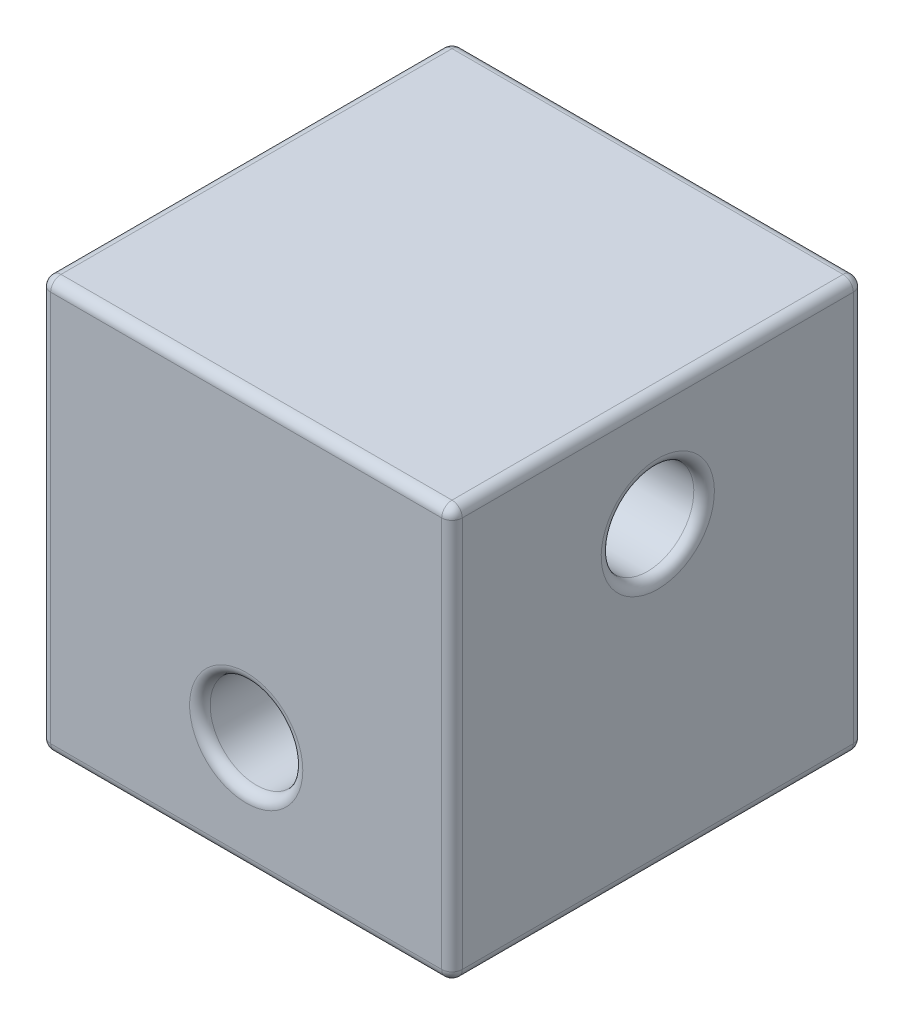
ISO-10303-21;
HEADER;
FILE_DESCRIPTION(('STEP AP214'),'2;1');
FILE_NAME('part.step','',(''),(''),'','','');
FILE_SCHEMA(('AUTOMOTIVE_DESIGN { 1 0 10303 214 1 1 1 1 }'));
ENDSEC;
DATA;
#1=APPLICATION_CONTEXT('core data for automotive mechanical design processes');
#2=APPLICATION_PROTOCOL_DEFINITION('international standard','automotive_design',2000,#1);
#3=PRODUCT_CONTEXT('',#1,'mechanical');
#4=PRODUCT('Part','Part','',(#3));
#5=PRODUCT_RELATED_PRODUCT_CATEGORY('part','',(#4));
#6=PRODUCT_DEFINITION_FORMATION('','',#4);
#7=PRODUCT_DEFINITION_CONTEXT('part definition',#1,'design');
#8=PRODUCT_DEFINITION('design','',#6,#7);
#9=PRODUCT_DEFINITION_SHAPE('','',#8);
#10=(LENGTH_UNIT() NAMED_UNIT(*) SI_UNIT(.MILLI.,.METRE.));
#11=(NAMED_UNIT(*) PLANE_ANGLE_UNIT() SI_UNIT($,.RADIAN.));
#12=(NAMED_UNIT(*) SI_UNIT($,.STERADIAN.) SOLID_ANGLE_UNIT());
#13=UNCERTAINTY_MEASURE_WITH_UNIT(LENGTH_MEASURE(1.E-05),#10,'distance_accuracy_value','');
#14=(GEOMETRIC_REPRESENTATION_CONTEXT(3) GLOBAL_UNCERTAINTY_ASSIGNED_CONTEXT((#13)) GLOBAL_UNIT_ASSIGNED_CONTEXT((#10,
#11,#12)) REPRESENTATION_CONTEXT('',''));
#15=CARTESIAN_POINT('',(0.,0.,0.));
#16=DIRECTION('',(0.,0.,1.));
#17=DIRECTION('',(1.,0.,0.));
#18=AXIS2_PLACEMENT_3D('',#15,#16,#17);
#19=CARTESIAN_POINT('',(20.,20.,20.));
#20=DIRECTION('',(-1.,0.,0.));
#21=DIRECTION('',(0.,-1.,0.));
#22=AXIS2_PLACEMENT_3D('',#19,#20,#21);
#23=PLANE('',#22);
#24=CARTESIAN_POINT('',(20.,9.,0.));
#25=DIRECTION('',(-1.,0.,0.));
#26=DIRECTION('',(0.,-1.,0.));
#27=AXIS2_PLACEMENT_3D('',#24,#25,#26);
#28=CIRCLE('',#27,5.5);
#29=CARTESIAN_POINT('',(20.,3.5,0.));
#30=VERTEX_POINT('',#29);
#31=EDGE_CURVE('E216',#30,#30,#28,.T.);
#32=ORIENTED_EDGE('',*,*,#31,.T.);
#33=EDGE_LOOP('',(#32));
#34=FACE_BOUND('',#33,.T.);
#35=DIRECTION('',(0.,1.,0.));
#36=VECTOR('',#35,1.);
#37=CARTESIAN_POINT('',(20.,-20.,19.));
#38=LINE('',#37,#36);
#39=CARTESIAN_POINT('',(20.,19.,19.));
#40=VERTEX_POINT('',#39);
#41=CARTESIAN_POINT('',(20.,-19.,19.));
#42=VERTEX_POINT('',#41);
#43=EDGE_CURVE('E203',#40,#42,#38,.F.);
#44=ORIENTED_EDGE('',*,*,#43,.T.);
#45=DIRECTION('',(0.,0.,-1.));
#46=VECTOR('',#45,1.);
#47=CARTESIAN_POINT('',(20.,-19.,20.));
#48=LINE('',#47,#46);
#49=CARTESIAN_POINT('',(20.,-19.,-19.));
#50=VERTEX_POINT('',#49);
#51=EDGE_CURVE('E212',#42,#50,#48,.T.);
#52=ORIENTED_EDGE('',*,*,#51,.T.);
#53=DIRECTION('',(0.,1.,0.));
#54=VECTOR('',#53,1.);
#55=CARTESIAN_POINT('',(20.,20.,-19.));
#56=LINE('',#55,#54);
#57=CARTESIAN_POINT('',(20.,19.,-19.));
#58=VERTEX_POINT('',#57);
#59=EDGE_CURVE('E209',#50,#58,#56,.T.);
#60=ORIENTED_EDGE('',*,*,#59,.T.);
#61=DIRECTION('',(0.,0.,-1.));
#62=VECTOR('',#61,1.);
#63=CARTESIAN_POINT('',(20.,19.,20.));
#64=LINE('',#63,#62);
#65=EDGE_CURVE('E206',#58,#40,#64,.F.);
#66=ORIENTED_EDGE('',*,*,#65,.T.);
#67=EDGE_LOOP('',(#44,#52,#60,#66));
#68=FACE_BOUND('',#67,.T.);
#69=ADVANCED_FACE('F39',(#34,#68),#23,.F.);
#70=CARTESIAN_POINT('',(-20.,20.,20.));
#71=DIRECTION('',(0.,-1.,0.));
#72=DIRECTION('',(0.,0.,-1.));
#73=AXIS2_PLACEMENT_3D('',#70,#71,#72);
#74=PLANE('',#73);
#75=DIRECTION('',(-1.,0.,0.));
#76=VECTOR('',#75,1.);
#77=CARTESIAN_POINT('',(20.,20.,19.));
#78=LINE('',#77,#76);
#79=CARTESIAN_POINT('',(-19.,20.,19.));
#80=VERTEX_POINT('',#79);
#81=CARTESIAN_POINT('',(19.,20.,19.));
#82=VERTEX_POINT('',#81);
#83=EDGE_CURVE('E231',#80,#82,#78,.F.);
#84=ORIENTED_EDGE('',*,*,#83,.T.);
#85=DIRECTION('',(0.,0.,-1.));
#86=VECTOR('',#85,1.);
#87=CARTESIAN_POINT('',(19.,20.,20.));
#88=LINE('',#87,#86);
#89=CARTESIAN_POINT('',(19.,20.,-19.));
#90=VERTEX_POINT('',#89);
#91=EDGE_CURVE('E237',#82,#90,#88,.T.);
#92=ORIENTED_EDGE('',*,*,#91,.T.);
#93=DIRECTION('',(-1.,0.,0.));
#94=VECTOR('',#93,1.);
#95=CARTESIAN_POINT('',(-20.,20.,-19.));
#96=LINE('',#95,#94);
#97=CARTESIAN_POINT('',(-19.,20.,-19.));
#98=VERTEX_POINT('',#97);
#99=EDGE_CURVE('E234',#90,#98,#96,.T.);
#100=ORIENTED_EDGE('',*,*,#99,.T.);
#101=DIRECTION('',(0.,0.,-1.));
#102=VECTOR('',#101,1.);
#103=CARTESIAN_POINT('',(-19.,20.,20.));
#104=LINE('',#103,#102);
#105=EDGE_CURVE('E228',#98,#80,#104,.F.);
#106=ORIENTED_EDGE('',*,*,#105,.T.);
#107=EDGE_LOOP('',(#84,#92,#100,#106));
#108=FACE_BOUND('',#107,.T.);
#109=ADVANCED_FACE('F358',(#108),#74,.F.);
#110=CARTESIAN_POINT('',(-20.,20.,20.));
#111=DIRECTION('',(1.,0.,0.));
#112=DIRECTION('',(0.,1.,0.));
#113=AXIS2_PLACEMENT_3D('',#110,#111,#112);
#114=PLANE('',#113);
#115=DIRECTION('',(0.,-1.,0.));
#116=VECTOR('',#115,1.);
#117=CARTESIAN_POINT('',(-20.,20.,19.));
#118=LINE('',#117,#116);
#119=CARTESIAN_POINT('',(-20.,-19.,19.));
#120=VERTEX_POINT('',#119);
#121=CARTESIAN_POINT('',(-20.,19.,19.));
#122=VERTEX_POINT('',#121);
#123=EDGE_CURVE('E49',#120,#122,#118,.F.);
#124=ORIENTED_EDGE('',*,*,#123,.T.);
#125=DIRECTION('',(0.,0.,-1.));
#126=VECTOR('',#125,1.);
#127=CARTESIAN_POINT('',(-20.,19.,20.));
#128=LINE('',#127,#126);
#129=CARTESIAN_POINT('',(-20.,19.,-19.));
#130=VERTEX_POINT('',#129);
#131=EDGE_CURVE('E11',#122,#130,#128,.T.);
#132=ORIENTED_EDGE('',*,*,#131,.T.);
#133=DIRECTION('',(0.,-1.,0.));
#134=VECTOR('',#133,1.);
#135=CARTESIAN_POINT('',(-20.,20.,-19.));
#136=LINE('',#135,#134);
#137=CARTESIAN_POINT('',(-20.,-19.,-19.));
#138=VERTEX_POINT('',#137);
#139=EDGE_CURVE('E260',#130,#138,#136,.T.);
#140=ORIENTED_EDGE('',*,*,#139,.T.);
#141=DIRECTION('',(0.,0.,-1.));
#142=VECTOR('',#141,1.);
#143=CARTESIAN_POINT('',(-20.,-19.,20.));
#144=LINE('',#143,#142);
#145=EDGE_CURVE('E60',#138,#120,#144,.F.);
#146=ORIENTED_EDGE('',*,*,#145,.T.);
#147=EDGE_LOOP('',(#124,#132,#140,#146));
#148=FACE_BOUND('',#147,.T.);
#149=CARTESIAN_POINT('',(-20.,9.,0.));
#150=DIRECTION('',(1.,0.,0.));
#151=DIRECTION('',(0.,1.,0.));
#152=AXIS2_PLACEMENT_3D('',#149,#150,#151);
#153=CIRCLE('',#152,5.5);
#154=CARTESIAN_POINT('',(-20.,14.5,0.));
#155=VERTEX_POINT('',#154);
#156=EDGE_CURVE('E256',#155,#155,#153,.T.);
#157=ORIENTED_EDGE('',*,*,#156,.T.);
#158=EDGE_LOOP('',(#157));
#159=FACE_BOUND('',#158,.T.);
#160=ADVANCED_FACE('F372',(#148,#159),#114,.F.);
#161=CARTESIAN_POINT('',(-20.,-20.,20.));
#162=DIRECTION('',(0.,1.,0.));
#163=DIRECTION('',(0.,0.,1.));
#164=AXIS2_PLACEMENT_3D('',#161,#162,#163);
#165=PLANE('',#164);
#166=DIRECTION('',(0.,0.,-1.));
#167=VECTOR('',#166,1.);
#168=CARTESIAN_POINT('',(-19.,-20.,20.));
#169=LINE('',#168,#167);
#170=CARTESIAN_POINT('',(-19.,-20.,19.));
#171=VERTEX_POINT('',#170);
#172=CARTESIAN_POINT('',(-19.,-20.,-19.));
#173=VERTEX_POINT('',#172);
#174=EDGE_CURVE('E132',#171,#173,#169,.T.);
#175=ORIENTED_EDGE('',*,*,#174,.T.);
#176=DIRECTION('',(1.,0.,0.));
#177=VECTOR('',#176,1.);
#178=CARTESIAN_POINT('',(-20.,-20.,-19.));
#179=LINE('',#178,#177);
#180=CARTESIAN_POINT('',(19.,-20.,-19.));
#181=VERTEX_POINT('',#180);
#182=EDGE_CURVE('E175',#173,#181,#179,.T.);
#183=ORIENTED_EDGE('',*,*,#182,.T.);
#184=DIRECTION('',(0.,0.,-1.));
#185=VECTOR('',#184,1.);
#186=CARTESIAN_POINT('',(19.,-20.,20.));
#187=LINE('',#186,#185);
#188=CARTESIAN_POINT('',(19.,-20.,19.));
#189=VERTEX_POINT('',#188);
#190=EDGE_CURVE('E135',#181,#189,#187,.F.);
#191=ORIENTED_EDGE('',*,*,#190,.T.);
#192=DIRECTION('',(1.,0.,0.));
#193=VECTOR('',#192,1.);
#194=CARTESIAN_POINT('',(-20.,-20.,19.));
#195=LINE('',#194,#193);
#196=EDGE_CURVE('E127',#189,#171,#195,.F.);
#197=ORIENTED_EDGE('',*,*,#196,.T.);
#198=EDGE_LOOP('',(#175,#183,#191,#197));
#199=FACE_BOUND('',#198,.T.);
#200=ADVANCED_FACE('F129',(#199),#165,.F.);
#201=CARTESIAN_POINT('',(0.,0.,20.));
#202=DIRECTION('',(0.,0.,1.));
#203=DIRECTION('',(1.,0.,0.));
#204=AXIS2_PLACEMENT_3D('',#201,#202,#203);
#205=PLANE('',#204);
#206=CARTESIAN_POINT('',(0.,-9.,20.));
#207=DIRECTION('',(0.,0.,1.));
#208=DIRECTION('',(1.,0.,0.));
#209=AXIS2_PLACEMENT_3D('',#206,#207,#208);
#210=CIRCLE('',#209,5.5);
#211=CARTESIAN_POINT('',(5.5,-9.,20.));
#212=VERTEX_POINT('',#211);
#213=EDGE_CURVE('E252',#212,#212,#210,.F.);
#214=ORIENTED_EDGE('',*,*,#213,.T.);
#215=EDGE_LOOP('',(#214));
#216=FACE_BOUND('',#215,.T.);
#217=DIRECTION('',(1.,0.,0.));
#218=VECTOR('',#217,1.);
#219=CARTESIAN_POINT('',(20.,-19.,20.));
#220=LINE('',#219,#218);
#221=CARTESIAN_POINT('',(-19.,-19.,20.));
#222=VERTEX_POINT('',#221);
#223=CARTESIAN_POINT('',(19.,-19.,20.));
#224=VERTEX_POINT('',#223);
#225=EDGE_CURVE('E147',#222,#224,#220,.T.);
#226=ORIENTED_EDGE('',*,*,#225,.T.);
#227=DIRECTION('',(0.,1.,0.));
#228=VECTOR('',#227,1.);
#229=CARTESIAN_POINT('',(19.,20.,20.));
#230=LINE('',#229,#228);
#231=CARTESIAN_POINT('',(19.,19.,20.));
#232=VERTEX_POINT('',#231);
#233=EDGE_CURVE('E249',#224,#232,#230,.T.);
#234=ORIENTED_EDGE('',*,*,#233,.T.);
#235=DIRECTION('',(-1.,0.,0.));
#236=VECTOR('',#235,1.);
#237=CARTESIAN_POINT('',(-20.,19.,20.));
#238=LINE('',#237,#236);
#239=CARTESIAN_POINT('',(-19.,19.,20.));
#240=VERTEX_POINT('',#239);
#241=EDGE_CURVE('E244',#232,#240,#238,.T.);
#242=ORIENTED_EDGE('',*,*,#241,.T.);
#243=DIRECTION('',(0.,-1.,0.));
#244=VECTOR('',#243,1.);
#245=CARTESIAN_POINT('',(-19.,-20.,20.));
#246=LINE('',#245,#244);
#247=EDGE_CURVE('E241',#240,#222,#246,.T.);
#248=ORIENTED_EDGE('',*,*,#247,.T.);
#249=EDGE_LOOP('',(#226,#234,#242,#248));
#250=FACE_BOUND('',#249,.T.);
#251=ADVANCED_FACE('F623',(#216,#250),#205,.T.);
#252=CARTESIAN_POINT('',(0.,0.,-20.));
#253=DIRECTION('',(0.,0.,1.));
#254=DIRECTION('',(1.,0.,0.));
#255=AXIS2_PLACEMENT_3D('',#252,#253,#254);
#256=PLANE('',#255);
#257=CARTESIAN_POINT('',(0.,-9.,-20.));
#258=DIRECTION('',(0.,0.,1.));
#259=DIRECTION('',(1.,0.,0.));
#260=AXIS2_PLACEMENT_3D('',#257,#258,#259);
#261=CIRCLE('',#260,5.5);
#262=CARTESIAN_POINT('',(5.5,-9.,-20.));
#263=VERTEX_POINT('',#262);
#264=EDGE_CURVE('E191',#263,#263,#261,.T.);
#265=ORIENTED_EDGE('',*,*,#264,.T.);
#266=EDGE_LOOP('',(#265));
#267=FACE_BOUND('',#266,.T.);
#268=DIRECTION('',(0.,1.,0.));
#269=VECTOR('',#268,1.);
#270=CARTESIAN_POINT('',(19.,0.,-20.));
#271=LINE('',#270,#269);
#272=CARTESIAN_POINT('',(19.,19.,-20.));
#273=VERTEX_POINT('',#272);
#274=CARTESIAN_POINT('',(19.,-19.,-20.));
#275=VERTEX_POINT('',#274);
#276=EDGE_CURVE('E184',#273,#275,#271,.F.);
#277=ORIENTED_EDGE('',*,*,#276,.T.);
#278=DIRECTION('',(1.,0.,0.));
#279=VECTOR('',#278,1.);
#280=CARTESIAN_POINT('',(0.,-19.,-20.));
#281=LINE('',#280,#279);
#282=CARTESIAN_POINT('',(-19.,-19.,-20.));
#283=VERTEX_POINT('',#282);
#284=EDGE_CURVE('E187',#275,#283,#281,.F.);
#285=ORIENTED_EDGE('',*,*,#284,.T.);
#286=DIRECTION('',(0.,-1.,0.));
#287=VECTOR('',#286,1.);
#288=CARTESIAN_POINT('',(-19.,0.,-20.));
#289=LINE('',#288,#287);
#290=CARTESIAN_POINT('',(-19.,19.,-20.));
#291=VERTEX_POINT('',#290);
#292=EDGE_CURVE('E178',#283,#291,#289,.F.);
#293=ORIENTED_EDGE('',*,*,#292,.T.);
#294=DIRECTION('',(-1.,0.,0.));
#295=VECTOR('',#294,1.);
#296=CARTESIAN_POINT('',(0.,19.,-20.));
#297=LINE('',#296,#295);
#298=EDGE_CURVE('E181',#291,#273,#297,.F.);
#299=ORIENTED_EDGE('',*,*,#298,.T.);
#300=EDGE_LOOP('',(#277,#285,#293,#299));
#301=FACE_BOUND('',#300,.T.);
#302=ADVANCED_FACE('F614',(#267,#301),#256,.F.);
#303=CARTESIAN_POINT('',(0.,-9.,-20.));
#304=DIRECTION('',(0.,0.,1.));
#305=DIRECTION('',(1.,0.,0.));
#306=AXIS2_PLACEMENT_3D('',#303,#304,#305);
#307=CYLINDRICAL_SURFACE('',#306,4.5);
#308=CARTESIAN_POINT('',(0.,-9.,-19.));
#309=DIRECTION('',(0.,0.,1.));
#310=DIRECTION('',(1.,0.,0.));
#311=AXIS2_PLACEMENT_3D('',#308,#309,#310);
#312=CIRCLE('',#311,4.5);
#313=CARTESIAN_POINT('',(4.5,-9.,-19.));
#314=VERTEX_POINT('',#313);
#315=EDGE_CURVE('E199',#314,#314,#312,.F.);
#316=ORIENTED_EDGE('',*,*,#315,.T.);
#317=EDGE_LOOP('',(#316));
#318=FACE_BOUND('',#317,.T.);
#319=CARTESIAN_POINT('',(0.,-9.,19.));
#320=DIRECTION('',(0.,0.,1.));
#321=DIRECTION('',(1.,0.,0.));
#322=AXIS2_PLACEMENT_3D('',#319,#320,#321);
#323=CIRCLE('',#322,4.5);
#324=CARTESIAN_POINT('',(4.5,-9.,19.));
#325=VERTEX_POINT('',#324);
#326=EDGE_CURVE('E195',#325,#325,#323,.T.);
#327=ORIENTED_EDGE('',*,*,#326,.T.);
#328=EDGE_LOOP('',(#327));
#329=FACE_BOUND('',#328,.T.);
#330=ADVANCED_FACE('F605',(#318,#329),#307,.F.);
#331=CARTESIAN_POINT('',(20.,9.,0.));
#332=DIRECTION('',(-1.,0.,0.));
#333=DIRECTION('',(0.,-1.,0.));
#334=AXIS2_PLACEMENT_3D('',#331,#332,#333);
#335=CYLINDRICAL_SURFACE('',#334,4.5);
#336=CARTESIAN_POINT('',(19.,9.,0.));
#337=DIRECTION('',(-1.,0.,0.));
#338=DIRECTION('',(0.,-1.,0.));
#339=AXIS2_PLACEMENT_3D('',#336,#337,#338);
#340=CIRCLE('',#339,4.5);
#341=CARTESIAN_POINT('',(19.,4.5,0.));
#342=VERTEX_POINT('',#341);
#343=EDGE_CURVE('E224',#342,#342,#340,.F.);
#344=ORIENTED_EDGE('',*,*,#343,.T.);
#345=EDGE_LOOP('',(#344));
#346=FACE_BOUND('',#345,.T.);
#347=CARTESIAN_POINT('',(-19.,9.,0.));
#348=DIRECTION('',(1.,0.,0.));
#349=DIRECTION('',(0.,1.,0.));
#350=AXIS2_PLACEMENT_3D('',#347,#348,#349);
#351=CIRCLE('',#350,4.5);
#352=CARTESIAN_POINT('',(-19.,13.5,0.));
#353=VERTEX_POINT('',#352);
#354=EDGE_CURVE('E220',#353,#353,#351,.F.);
#355=ORIENTED_EDGE('',*,*,#354,.T.);
#356=EDGE_LOOP('',(#355));
#357=FACE_BOUND('',#356,.T.);
#358=ADVANCED_FACE('F597',(#346,#357),#335,.F.);
#359=CARTESIAN_POINT('',(0.,19.,19.));
#360=DIRECTION('',(1.,0.,0.));
#361=DIRECTION('',(0.,0.,-1.));
#362=AXIS2_PLACEMENT_3D('',#359,#360,#361);
#363=CYLINDRICAL_SURFACE('',#362,1.);
#364=CARTESIAN_POINT('',(-19.,19.,19.));
#365=DIRECTION('',(-1.,0.,0.));
#366=DIRECTION('',(0.,0.,1.));
#367=AXIS2_PLACEMENT_3D('',#364,#365,#366);
#368=CIRCLE('',#367,1.);
#369=EDGE_CURVE('E43',#240,#80,#368,.T.);
#370=ORIENTED_EDGE('',*,*,#369,.F.);
#371=ORIENTED_EDGE('',*,*,#241,.F.);
#372=CARTESIAN_POINT('',(19.,19.,19.));
#373=DIRECTION('',(1.,0.,0.));
#374=DIRECTION('',(0.,0.,-1.));
#375=AXIS2_PLACEMENT_3D('',#372,#373,#374);
#376=CIRCLE('',#375,1.);
#377=EDGE_CURVE('E171',#82,#232,#376,.T.);
#378=ORIENTED_EDGE('',*,*,#377,.F.);
#379=ORIENTED_EDGE('',*,*,#83,.F.);
#380=EDGE_LOOP('',(#370,#371,#378,#379));
#381=FACE_BOUND('',#380,.T.);
#382=ADVANCED_FACE('F361',(#381),#363,.T.);
#383=CARTESIAN_POINT('',(-19.,19.,19.));
#384=DIRECTION('',(0.,0.,1.));
#385=DIRECTION('',(1.,0.,0.));
#386=AXIS2_PLACEMENT_3D('',#383,#384,#385);
#387=SPHERICAL_SURFACE('',#386,1.);
#388=CARTESIAN_POINT('',(-19.,19.,19.));
#389=DIRECTION('',(0.,1.,0.));
#390=DIRECTION('',(0.,0.,1.));
#391=AXIS2_PLACEMENT_3D('',#388,#389,#390);
#392=CIRCLE('',#391,1.);
#393=EDGE_CURVE('E326',#240,#122,#392,.F.);
#394=ORIENTED_EDGE('',*,*,#393,.F.);
#395=ORIENTED_EDGE('',*,*,#369,.T.);
#396=CARTESIAN_POINT('',(-19.,19.,19.));
#397=DIRECTION('',(0.,0.,1.));
#398=DIRECTION('',(1.,0.,0.));
#399=AXIS2_PLACEMENT_3D('',#396,#397,#398);
#400=CIRCLE('',#399,1.);
#401=EDGE_CURVE('E329',#122,#80,#400,.F.);
#402=ORIENTED_EDGE('',*,*,#401,.F.);
#403=EDGE_LOOP('',(#394,#395,#402));
#404=FACE_BOUND('',#403,.T.);
#405=ADVANCED_FACE('F365',(#404),#387,.T.);
#406=CARTESIAN_POINT('',(19.,19.,19.));
#407=DIRECTION('',(0.,0.,1.));
#408=DIRECTION('',(1.,0.,0.));
#409=AXIS2_PLACEMENT_3D('',#406,#407,#408);
#410=SPHERICAL_SURFACE('',#409,1.);
#411=CARTESIAN_POINT('',(19.,19.,19.));
#412=DIRECTION('',(0.,0.,1.));
#413=DIRECTION('',(1.,0.,0.));
#414=AXIS2_PLACEMENT_3D('',#411,#412,#413);
#415=CIRCLE('',#414,1.);
#416=EDGE_CURVE('E318',#82,#40,#415,.F.);
#417=ORIENTED_EDGE('',*,*,#416,.F.);
#418=ORIENTED_EDGE('',*,*,#377,.T.);
#419=CARTESIAN_POINT('',(19.,19.,19.));
#420=DIRECTION('',(0.,1.,0.));
#421=DIRECTION('',(0.,0.,1.));
#422=AXIS2_PLACEMENT_3D('',#419,#420,#421);
#423=CIRCLE('',#422,1.);
#424=EDGE_CURVE('E322',#40,#232,#423,.F.);
#425=ORIENTED_EDGE('',*,*,#424,.F.);
#426=EDGE_LOOP('',(#417,#418,#425));
#427=FACE_BOUND('',#426,.T.);
#428=ADVANCED_FACE('F338',(#427),#410,.T.);
#429=CARTESIAN_POINT('',(-19.,19.,20.));
#430=DIRECTION('',(0.,0.,-1.));
#431=DIRECTION('',(-1.,0.,0.));
#432=AXIS2_PLACEMENT_3D('',#429,#430,#431);
#433=CYLINDRICAL_SURFACE('',#432,1.);
#434=ORIENTED_EDGE('',*,*,#401,.T.);
#435=ORIENTED_EDGE('',*,*,#105,.F.);
#436=CARTESIAN_POINT('',(-19.,19.,-19.));
#437=DIRECTION('',(0.,0.,-1.));
#438=DIRECTION('',(-1.,0.,0.));
#439=AXIS2_PLACEMENT_3D('',#436,#437,#438);
#440=CIRCLE('',#439,1.);
#441=EDGE_CURVE('E310',#130,#98,#440,.T.);
#442=ORIENTED_EDGE('',*,*,#441,.F.);
#443=ORIENTED_EDGE('',*,*,#131,.F.);
#444=EDGE_LOOP('',(#434,#435,#442,#443));
#445=FACE_BOUND('',#444,.T.);
#446=ADVANCED_FACE('F369',(#445),#433,.T.);
#447=CARTESIAN_POINT('',(-19.,0.,19.));
#448=DIRECTION('',(0.,1.,0.));
#449=DIRECTION('',(-1.,0.,0.));
#450=AXIS2_PLACEMENT_3D('',#447,#448,#449);
#451=CYLINDRICAL_SURFACE('',#450,1.);
#452=ORIENTED_EDGE('',*,*,#393,.T.);
#453=ORIENTED_EDGE('',*,*,#123,.F.);
#454=CARTESIAN_POINT('',(-19.,-19.,19.));
#455=DIRECTION('',(0.,-1.,0.));
#456=DIRECTION('',(0.,0.,-1.));
#457=AXIS2_PLACEMENT_3D('',#454,#455,#456);
#458=CIRCLE('',#457,1.);
#459=EDGE_CURVE('E152',#222,#120,#458,.T.);
#460=ORIENTED_EDGE('',*,*,#459,.F.);
#461=ORIENTED_EDGE('',*,*,#247,.F.);
#462=EDGE_LOOP('',(#452,#453,#460,#461));
#463=FACE_BOUND('',#462,.T.);
#464=ADVANCED_FACE('F560',(#463),#451,.T.);
#465=CARTESIAN_POINT('',(0.,-19.,19.));
#466=DIRECTION('',(-1.,0.,0.));
#467=DIRECTION('',(0.,0.,1.));
#468=AXIS2_PLACEMENT_3D('',#465,#466,#467);
#469=CYLINDRICAL_SURFACE('',#468,1.);
#470=CARTESIAN_POINT('',(19.,-19.,19.));
#471=DIRECTION('',(1.,0.,0.));
#472=DIRECTION('',(0.,0.,-1.));
#473=AXIS2_PLACEMENT_3D('',#470,#471,#472);
#474=CIRCLE('',#473,1.);
#475=EDGE_CURVE('E153',#224,#189,#474,.T.);
#476=ORIENTED_EDGE('',*,*,#475,.F.);
#477=ORIENTED_EDGE('',*,*,#225,.F.);
#478=CARTESIAN_POINT('',(-19.,-19.,19.));
#479=DIRECTION('',(-1.,0.,0.));
#480=DIRECTION('',(0.,0.,1.));
#481=AXIS2_PLACEMENT_3D('',#478,#479,#480);
#482=CIRCLE('',#481,1.);
#483=EDGE_CURVE('E143',#171,#222,#482,.T.);
#484=ORIENTED_EDGE('',*,*,#483,.F.);
#485=ORIENTED_EDGE('',*,*,#196,.F.);
#486=EDGE_LOOP('',(#476,#477,#484,#485));
#487=FACE_BOUND('',#486,.T.);
#488=ADVANCED_FACE('F145',(#487),#469,.T.);
#489=CARTESIAN_POINT('',(19.,0.,19.));
#490=DIRECTION('',(0.,-1.,0.));
#491=DIRECTION('',(1.,0.,0.));
#492=AXIS2_PLACEMENT_3D('',#489,#490,#491);
#493=CYLINDRICAL_SURFACE('',#492,1.);
#494=ORIENTED_EDGE('',*,*,#424,.T.);
#495=ORIENTED_EDGE('',*,*,#233,.F.);
#496=CARTESIAN_POINT('',(19.,-19.,19.));
#497=DIRECTION('',(0.,-1.,0.));
#498=DIRECTION('',(0.,0.,-1.));
#499=AXIS2_PLACEMENT_3D('',#496,#497,#498);
#500=CIRCLE('',#499,1.);
#501=EDGE_CURVE('E303',#42,#224,#500,.T.);
#502=ORIENTED_EDGE('',*,*,#501,.F.);
#503=ORIENTED_EDGE('',*,*,#43,.F.);
#504=EDGE_LOOP('',(#494,#495,#502,#503));
#505=FACE_BOUND('',#504,.T.);
#506=ADVANCED_FACE('F346',(#505),#493,.T.);
#507=CARTESIAN_POINT('',(19.,19.,20.));
#508=DIRECTION('',(0.,0.,-1.));
#509=DIRECTION('',(-1.,0.,0.));
#510=AXIS2_PLACEMENT_3D('',#507,#508,#509);
#511=CYLINDRICAL_SURFACE('',#510,1.);
#512=ORIENTED_EDGE('',*,*,#416,.T.);
#513=ORIENTED_EDGE('',*,*,#65,.F.);
#514=CARTESIAN_POINT('',(19.,19.,-19.));
#515=DIRECTION('',(0.,0.,-1.));
#516=DIRECTION('',(-1.,0.,0.));
#517=AXIS2_PLACEMENT_3D('',#514,#515,#516);
#518=CIRCLE('',#517,1.);
#519=EDGE_CURVE('E299',#90,#58,#518,.T.);
#520=ORIENTED_EDGE('',*,*,#519,.F.);
#521=ORIENTED_EDGE('',*,*,#91,.F.);
#522=EDGE_LOOP('',(#512,#513,#520,#521));
#523=FACE_BOUND('',#522,.T.);
#524=ADVANCED_FACE('F355',(#523),#511,.T.);
#525=CARTESIAN_POINT('',(-20.,19.,-19.));
#526=DIRECTION('',(-1.,0.,0.));
#527=DIRECTION('',(0.,0.,1.));
#528=AXIS2_PLACEMENT_3D('',#525,#526,#527);
#529=CYLINDRICAL_SURFACE('',#528,1.);
#530=CARTESIAN_POINT('',(-19.,19.,-19.));
#531=DIRECTION('',(-1.,0.,0.));
#532=DIRECTION('',(0.,0.,1.));
#533=AXIS2_PLACEMENT_3D('',#530,#531,#532);
#534=CIRCLE('',#533,1.);
#535=EDGE_CURVE('E314',#98,#291,#534,.T.);
#536=ORIENTED_EDGE('',*,*,#535,.F.);
#537=ORIENTED_EDGE('',*,*,#99,.F.);
#538=CARTESIAN_POINT('',(19.,19.,-19.));
#539=DIRECTION('',(1.,0.,0.));
#540=DIRECTION('',(0.,0.,-1.));
#541=AXIS2_PLACEMENT_3D('',#538,#539,#540);
#542=CIRCLE('',#541,1.);
#543=EDGE_CURVE('E296',#273,#90,#542,.T.);
#544=ORIENTED_EDGE('',*,*,#543,.F.);
#545=ORIENTED_EDGE('',*,*,#298,.F.);
#546=EDGE_LOOP('',(#536,#537,#544,#545));
#547=FACE_BOUND('',#546,.T.);
#548=ADVANCED_FACE('F529',(#547),#529,.T.);
#549=CARTESIAN_POINT('',(-19.,19.,-19.));
#550=DIRECTION('',(0.,0.,1.));
#551=DIRECTION('',(1.,0.,0.));
#552=AXIS2_PLACEMENT_3D('',#549,#550,#551);
#553=SPHERICAL_SURFACE('',#552,1.);
#554=ORIENTED_EDGE('',*,*,#441,.T.);
#555=ORIENTED_EDGE('',*,*,#535,.T.);
#556=CARTESIAN_POINT('',(-19.,19.,-19.));
#557=DIRECTION('',(0.,1.,0.));
#558=DIRECTION('',(0.,0.,1.));
#559=AXIS2_PLACEMENT_3D('',#556,#557,#558);
#560=CIRCLE('',#559,1.);
#561=EDGE_CURVE('E160',#130,#291,#560,.F.);
#562=ORIENTED_EDGE('',*,*,#561,.F.);
#563=EDGE_LOOP('',(#554,#555,#562));
#564=FACE_BOUND('',#563,.T.);
#565=ADVANCED_FACE('F403',(#564),#553,.T.);
#566=CARTESIAN_POINT('',(-19.,-19.,19.));
#567=DIRECTION('',(0.,0.,1.));
#568=DIRECTION('',(1.,0.,0.));
#569=AXIS2_PLACEMENT_3D('',#566,#567,#568);
#570=SPHERICAL_SURFACE('',#569,1.);
#571=ORIENTED_EDGE('',*,*,#483,.T.);
#572=ORIENTED_EDGE('',*,*,#459,.T.);
#573=CARTESIAN_POINT('',(-19.,-19.,19.));
#574=DIRECTION('',(0.,0.,1.));
#575=DIRECTION('',(1.,0.,0.));
#576=AXIS2_PLACEMENT_3D('',#573,#574,#575);
#577=CIRCLE('',#576,1.);
#578=EDGE_CURVE('E156',#171,#120,#577,.F.);
#579=ORIENTED_EDGE('',*,*,#578,.F.);
#580=EDGE_LOOP('',(#571,#572,#579));
#581=FACE_BOUND('',#580,.T.);
#582=ADVANCED_FACE('F157',(#581),#570,.T.);
#583=CARTESIAN_POINT('',(19.,-19.,19.));
#584=DIRECTION('',(0.,0.,1.));
#585=DIRECTION('',(1.,0.,0.));
#586=AXIS2_PLACEMENT_3D('',#583,#584,#585);
#587=SPHERICAL_SURFACE('',#586,1.);
#588=ORIENTED_EDGE('',*,*,#501,.T.);
#589=ORIENTED_EDGE('',*,*,#475,.T.);
#590=CARTESIAN_POINT('',(19.,-19.,19.));
#591=DIRECTION('',(0.,0.,1.));
#592=DIRECTION('',(1.,0.,0.));
#593=AXIS2_PLACEMENT_3D('',#590,#591,#592);
#594=CIRCLE('',#593,1.);
#595=EDGE_CURVE('E161',#42,#189,#594,.F.);
#596=ORIENTED_EDGE('',*,*,#595,.F.);
#597=EDGE_LOOP('',(#588,#589,#596));
#598=FACE_BOUND('',#597,.T.);
#599=ADVANCED_FACE('F393',(#598),#587,.T.);
#600=CARTESIAN_POINT('',(19.,19.,-19.));
#601=DIRECTION('',(0.,0.,1.));
#602=DIRECTION('',(1.,0.,0.));
#603=AXIS2_PLACEMENT_3D('',#600,#601,#602);
#604=SPHERICAL_SURFACE('',#603,1.);
#605=ORIENTED_EDGE('',*,*,#543,.T.);
#606=ORIENTED_EDGE('',*,*,#519,.T.);
#607=CARTESIAN_POINT('',(19.,19.,-19.));
#608=DIRECTION('',(0.,1.,0.));
#609=DIRECTION('',(0.,0.,1.));
#610=AXIS2_PLACEMENT_3D('',#607,#608,#609);
#611=CIRCLE('',#610,1.);
#612=EDGE_CURVE('E286',#273,#58,#611,.F.);
#613=ORIENTED_EDGE('',*,*,#612,.F.);
#614=EDGE_LOOP('',(#605,#606,#613));
#615=FACE_BOUND('',#614,.T.);
#616=ADVANCED_FACE('F395',(#615),#604,.T.);
#617=CARTESIAN_POINT('',(-19.,20.,-19.));
#618=DIRECTION('',(0.,-1.,0.));
#619=DIRECTION('',(1.,0.,0.));
#620=AXIS2_PLACEMENT_3D('',#617,#618,#619);
#621=CYLINDRICAL_SURFACE('',#620,1.);
#622=ORIENTED_EDGE('',*,*,#561,.T.);
#623=ORIENTED_EDGE('',*,*,#292,.F.);
#624=CARTESIAN_POINT('',(-19.,-19.,-19.));
#625=DIRECTION('',(0.,-1.,0.));
#626=DIRECTION('',(0.,0.,-1.));
#627=AXIS2_PLACEMENT_3D('',#624,#625,#626);
#628=CIRCLE('',#627,1.);
#629=EDGE_CURVE('E282',#138,#283,#628,.T.);
#630=ORIENTED_EDGE('',*,*,#629,.F.);
#631=ORIENTED_EDGE('',*,*,#139,.F.);
#632=EDGE_LOOP('',(#622,#623,#630,#631));
#633=FACE_BOUND('',#632,.T.);
#634=ADVANCED_FACE('F378',(#633),#621,.T.);
#635=CARTESIAN_POINT('',(-19.,-19.,20.));
#636=DIRECTION('',(0.,0.,-1.));
#637=DIRECTION('',(-1.,0.,0.));
#638=AXIS2_PLACEMENT_3D('',#635,#636,#637);
#639=CYLINDRICAL_SURFACE('',#638,1.);
#640=ORIENTED_EDGE('',*,*,#578,.T.);
#641=ORIENTED_EDGE('',*,*,#145,.F.);
#642=CARTESIAN_POINT('',(-19.,-19.,-19.));
#643=DIRECTION('',(0.,0.,-1.));
#644=DIRECTION('',(-1.,0.,0.));
#645=AXIS2_PLACEMENT_3D('',#642,#643,#644);
#646=CIRCLE('',#645,1.);
#647=EDGE_CURVE('E165',#173,#138,#646,.T.);
#648=ORIENTED_EDGE('',*,*,#647,.F.);
#649=ORIENTED_EDGE('',*,*,#174,.F.);
#650=EDGE_LOOP('',(#640,#641,#648,#649));
#651=FACE_BOUND('',#650,.T.);
#652=ADVANCED_FACE('F163',(#651),#639,.T.);
#653=CARTESIAN_POINT('',(19.,-19.,20.));
#654=DIRECTION('',(0.,0.,-1.));
#655=DIRECTION('',(-1.,0.,0.));
#656=AXIS2_PLACEMENT_3D('',#653,#654,#655);
#657=CYLINDRICAL_SURFACE('',#656,1.);
#658=ORIENTED_EDGE('',*,*,#595,.T.);
#659=ORIENTED_EDGE('',*,*,#190,.F.);
#660=CARTESIAN_POINT('',(19.,-19.,-19.));
#661=DIRECTION('',(0.,0.,-1.));
#662=DIRECTION('',(-1.,0.,0.));
#663=AXIS2_PLACEMENT_3D('',#660,#661,#662);
#664=CIRCLE('',#663,1.);
#665=EDGE_CURVE('E276',#50,#181,#664,.T.);
#666=ORIENTED_EDGE('',*,*,#665,.F.);
#667=ORIENTED_EDGE('',*,*,#51,.F.);
#668=EDGE_LOOP('',(#658,#659,#666,#667));
#669=FACE_BOUND('',#668,.T.);
#670=ADVANCED_FACE('F391',(#669),#657,.T.);
#671=CARTESIAN_POINT('',(19.,20.,-19.));
#672=DIRECTION('',(0.,1.,0.));
#673=DIRECTION('',(-1.,0.,0.));
#674=AXIS2_PLACEMENT_3D('',#671,#672,#673);
#675=CYLINDRICAL_SURFACE('',#674,1.);
#676=ORIENTED_EDGE('',*,*,#612,.T.);
#677=ORIENTED_EDGE('',*,*,#59,.F.);
#678=CARTESIAN_POINT('',(19.,-19.,-19.));
#679=DIRECTION('',(0.,-1.,0.));
#680=DIRECTION('',(0.,0.,-1.));
#681=AXIS2_PLACEMENT_3D('',#678,#679,#680);
#682=CIRCLE('',#681,1.);
#683=EDGE_CURVE('E273',#275,#50,#682,.T.);
#684=ORIENTED_EDGE('',*,*,#683,.F.);
#685=ORIENTED_EDGE('',*,*,#276,.F.);
#686=EDGE_LOOP('',(#676,#677,#684,#685));
#687=FACE_BOUND('',#686,.T.);
#688=ADVANCED_FACE('F421',(#687),#675,.T.);
#689=CARTESIAN_POINT('',(-19.,-19.,-19.));
#690=DIRECTION('',(0.,0.,1.));
#691=DIRECTION('',(1.,0.,0.));
#692=AXIS2_PLACEMENT_3D('',#689,#690,#691);
#693=SPHERICAL_SURFACE('',#692,1.);
#694=ORIENTED_EDGE('',*,*,#647,.T.);
#695=ORIENTED_EDGE('',*,*,#629,.T.);
#696=CARTESIAN_POINT('',(-19.,-19.,-19.));
#697=DIRECTION('',(-1.,0.,0.));
#698=DIRECTION('',(0.,0.,1.));
#699=AXIS2_PLACEMENT_3D('',#696,#697,#698);
#700=CIRCLE('',#699,1.);
#701=EDGE_CURVE('E270',#173,#283,#700,.F.);
#702=ORIENTED_EDGE('',*,*,#701,.F.);
#703=EDGE_LOOP('',(#694,#695,#702));
#704=FACE_BOUND('',#703,.T.);
#705=ADVANCED_FACE('F380',(#704),#693,.T.);
#706=CARTESIAN_POINT('',(19.,-19.,-19.));
#707=DIRECTION('',(0.,0.,1.));
#708=DIRECTION('',(1.,0.,0.));
#709=AXIS2_PLACEMENT_3D('',#706,#707,#708);
#710=SPHERICAL_SURFACE('',#709,1.);
#711=ORIENTED_EDGE('',*,*,#683,.T.);
#712=ORIENTED_EDGE('',*,*,#665,.T.);
#713=CARTESIAN_POINT('',(19.,-19.,-19.));
#714=DIRECTION('',(1.,0.,0.));
#715=DIRECTION('',(0.,0.,-1.));
#716=AXIS2_PLACEMENT_3D('',#713,#714,#715);
#717=CIRCLE('',#716,1.);
#718=EDGE_CURVE('E267',#275,#181,#717,.F.);
#719=ORIENTED_EDGE('',*,*,#718,.F.);
#720=EDGE_LOOP('',(#711,#712,#719));
#721=FACE_BOUND('',#720,.T.);
#722=ADVANCED_FACE('F388',(#721),#710,.T.);
#723=CARTESIAN_POINT('',(-20.,-19.,-19.));
#724=DIRECTION('',(1.,0.,0.));
#725=DIRECTION('',(0.,0.,-1.));
#726=AXIS2_PLACEMENT_3D('',#723,#724,#725);
#727=CYLINDRICAL_SURFACE('',#726,1.);
#728=ORIENTED_EDGE('',*,*,#701,.T.);
#729=ORIENTED_EDGE('',*,*,#284,.F.);
#730=ORIENTED_EDGE('',*,*,#718,.T.);
#731=ORIENTED_EDGE('',*,*,#182,.F.);
#732=EDGE_LOOP('',(#728,#729,#730,#731));
#733=FACE_BOUND('',#732,.T.);
#734=ADVANCED_FACE('F384',(#733),#727,.T.);
#735=CARTESIAN_POINT('',(0.,-9.,-19.));
#736=DIRECTION('',(0.,0.,1.));
#737=DIRECTION('',(1.,0.,0.));
#738=AXIS2_PLACEMENT_3D('',#735,#736,#737);
#739=TOROIDAL_SURFACE('',#738,5.5,1.);
#740=ORIENTED_EDGE('',*,*,#315,.F.);
#741=EDGE_LOOP('',(#740));
#742=FACE_BOUND('',#741,.T.);
#743=ORIENTED_EDGE('',*,*,#264,.F.);
#744=EDGE_LOOP('',(#743));
#745=FACE_BOUND('',#744,.T.);
#746=ADVANCED_FACE('F416',(#742,#745),#739,.T.);
#747=CARTESIAN_POINT('',(19.,9.,0.));
#748=DIRECTION('',(-1.,0.,0.));
#749=DIRECTION('',(0.,-1.,0.));
#750=AXIS2_PLACEMENT_3D('',#747,#748,#749);
#751=TOROIDAL_SURFACE('',#750,5.5,1.);
#752=ORIENTED_EDGE('',*,*,#343,.F.);
#753=EDGE_LOOP('',(#752));
#754=FACE_BOUND('',#753,.T.);
#755=ORIENTED_EDGE('',*,*,#31,.F.);
#756=EDGE_LOOP('',(#755));
#757=FACE_BOUND('',#756,.T.);
#758=ADVANCED_FACE('F464',(#754,#757),#751,.T.);
#759=CARTESIAN_POINT('',(0.,-9.,19.));
#760=DIRECTION('',(0.,0.,1.));
#761=DIRECTION('',(1.,0.,0.));
#762=AXIS2_PLACEMENT_3D('',#759,#760,#761);
#763=TOROIDAL_SURFACE('',#762,5.5,1.);
#764=ORIENTED_EDGE('',*,*,#213,.F.);
#765=EDGE_LOOP('',(#764));
#766=FACE_BOUND('',#765,.T.);
#767=ORIENTED_EDGE('',*,*,#326,.F.);
#768=EDGE_LOOP('',(#767));
#769=FACE_BOUND('',#768,.T.);
#770=ADVANCED_FACE('F472',(#766,#769),#763,.T.);
#771=CARTESIAN_POINT('',(-19.,9.,0.));
#772=DIRECTION('',(1.,0.,0.));
#773=DIRECTION('',(0.,1.,0.));
#774=AXIS2_PLACEMENT_3D('',#771,#772,#773);
#775=TOROIDAL_SURFACE('',#774,5.5,1.);
#776=ORIENTED_EDGE('',*,*,#156,.F.);
#777=EDGE_LOOP('',(#776));
#778=FACE_BOUND('',#777,.T.);
#779=ORIENTED_EDGE('',*,*,#354,.F.);
#780=EDGE_LOOP('',(#779));
#781=FACE_BOUND('',#780,.T.);
#782=ADVANCED_FACE('F41',(#778,#781),#775,.T.);
#783=CLOSED_SHELL('',(#69,#109,#160,#200,#251,#302,#330,#358,#382,#405,#428,#446,#464,#488,#506,
#524,#548,#565,#582,#599,#616,#634,#652,#670,#688,#705,#722,#734,#746,#758,#770,#782));
#784=MANIFOLD_SOLID_BREP('B2',#783);
#785=ADVANCED_BREP_SHAPE_REPRESENTATION('',(#18,#784),#14);
#786=SHAPE_DEFINITION_REPRESENTATION(#9,#785);
ENDSEC;
END-ISO-10303-21;
